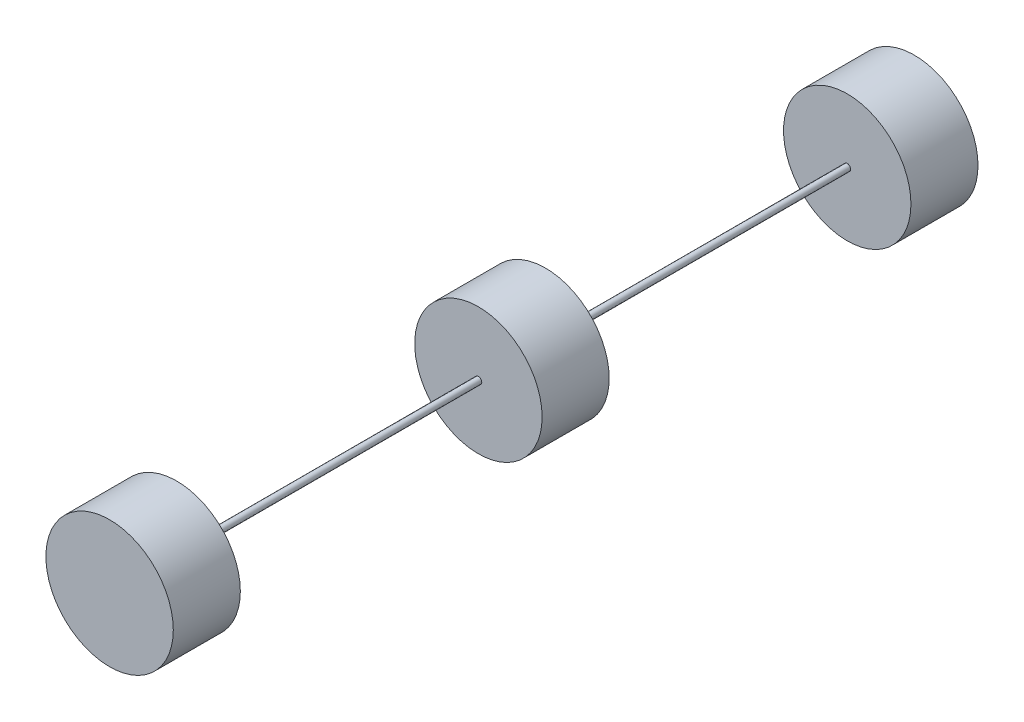
ISO-10303-21;
HEADER;
FILE_DESCRIPTION(('STEP AP214'),'2;1');
FILE_NAME('part.step','',(''),(''),'','','');
FILE_SCHEMA(('AUTOMOTIVE_DESIGN { 1 0 10303 214 1 1 1 1 }'));
ENDSEC;
DATA;
#1=APPLICATION_CONTEXT('core data for automotive mechanical design processes');
#2=APPLICATION_PROTOCOL_DEFINITION('international standard','automotive_design',2000,#1);
#3=PRODUCT_CONTEXT('',#1,'mechanical');
#4=PRODUCT('Part','Part','',(#3));
#5=PRODUCT_RELATED_PRODUCT_CATEGORY('part','',(#4));
#6=PRODUCT_DEFINITION_FORMATION('','',#4);
#7=PRODUCT_DEFINITION_CONTEXT('part definition',#1,'design');
#8=PRODUCT_DEFINITION('design','',#6,#7);
#9=PRODUCT_DEFINITION_SHAPE('','',#8);
#10=(LENGTH_UNIT() NAMED_UNIT(*) SI_UNIT(.MILLI.,.METRE.));
#11=(NAMED_UNIT(*) PLANE_ANGLE_UNIT() SI_UNIT($,.RADIAN.));
#12=(NAMED_UNIT(*) SI_UNIT($,.STERADIAN.) SOLID_ANGLE_UNIT());
#13=UNCERTAINTY_MEASURE_WITH_UNIT(LENGTH_MEASURE(1.E-05),#10,'distance_accuracy_value','');
#14=(GEOMETRIC_REPRESENTATION_CONTEXT(3) GLOBAL_UNCERTAINTY_ASSIGNED_CONTEXT((#13)) GLOBAL_UNIT_ASSIGNED_CONTEXT((#10,
#11,#12)) REPRESENTATION_CONTEXT('',''));
#15=CARTESIAN_POINT('',(0.,0.,0.));
#16=DIRECTION('',(0.,0.,1.));
#17=DIRECTION('',(1.,0.,0.));
#18=AXIS2_PLACEMENT_3D('',#15,#16,#17);
#19=CARTESIAN_POINT('',(0.,0.,20.));
#20=DIRECTION('',(0.,0.,-1.));
#21=DIRECTION('',(-1.,0.,0.));
#22=AXIS2_PLACEMENT_3D('',#19,#20,#21);
#23=CYLINDRICAL_SURFACE('',#22,19.);
#24=CARTESIAN_POINT('',(0.,0.,20.));
#25=DIRECTION('',(0.,0.,1.));
#26=DIRECTION('',(1.,0.,0.));
#27=AXIS2_PLACEMENT_3D('',#24,#25,#26);
#28=CIRCLE('',#27,19.);
#29=CARTESIAN_POINT('',(19.,0.,20.));
#30=VERTEX_POINT('',#29);
#31=EDGE_CURVE('E10',#30,#30,#28,.T.);
#32=ORIENTED_EDGE('',*,*,#31,.F.);
#33=EDGE_LOOP('',(#32));
#34=FACE_BOUND('',#33,.T.);
#35=CARTESIAN_POINT('',(0.,0.,0.));
#36=DIRECTION('',(0.,0.,1.));
#37=DIRECTION('',(1.,0.,0.));
#38=AXIS2_PLACEMENT_3D('',#35,#36,#37);
#39=CIRCLE('',#38,19.);
#40=CARTESIAN_POINT('',(19.,0.,0.));
#41=VERTEX_POINT('',#40);
#42=EDGE_CURVE('E42',#41,#41,#39,.T.);
#43=ORIENTED_EDGE('',*,*,#42,.T.);
#44=EDGE_LOOP('',(#43));
#45=FACE_BOUND('',#44,.T.);
#46=ADVANCED_FACE('F39',(#34,#45),#23,.T.);
#47=CARTESIAN_POINT('',(0.,0.,20.));
#48=DIRECTION('',(0.,0.,1.));
#49=DIRECTION('',(1.,0.,0.));
#50=AXIS2_PLACEMENT_3D('',#47,#48,#49);
#51=PLANE('',#50);
#52=CARTESIAN_POINT('',(0.,0.,20.));
#53=DIRECTION('',(0.,0.,1.));
#54=DIRECTION('',(1.,0.,0.));
#55=AXIS2_PLACEMENT_3D('',#52,#53,#54);
#56=CIRCLE('',#55,1.);
#57=CARTESIAN_POINT('',(-1.,0.,20.));
#58=VERTEX_POINT('',#57);
#59=EDGE_CURVE('E53',#58,#58,#56,.T.);
#60=ORIENTED_EDGE('',*,*,#59,.F.);
#61=EDGE_LOOP('',(#60));
#62=FACE_BOUND('',#61,.T.);
#63=ORIENTED_EDGE('',*,*,#31,.T.);
#64=EDGE_LOOP('',(#63));
#65=FACE_BOUND('',#64,.T.);
#66=ADVANCED_FACE('F103',(#62,#65),#51,.T.);
#67=CARTESIAN_POINT('',(0.,0.,0.));
#68=DIRECTION('',(0.,0.,1.));
#69=DIRECTION('',(1.,0.,0.));
#70=AXIS2_PLACEMENT_3D('',#67,#68,#69);
#71=PLANE('',#70);
#72=ORIENTED_EDGE('',*,*,#42,.F.);
#73=EDGE_LOOP('',(#72));
#74=FACE_BOUND('',#73,.T.);
#75=ADVANCED_FACE('F108',(#74),#71,.F.);
#76=CARTESIAN_POINT('',(0.,0.,110.));
#77=DIRECTION('',(0.,0.,-1.));
#78=DIRECTION('',(-1.,0.,0.));
#79=AXIS2_PLACEMENT_3D('',#76,#77,#78);
#80=CYLINDRICAL_SURFACE('',#79,1.);
#81=CARTESIAN_POINT('',(0.,0.,110.));
#82=DIRECTION('',(0.,0.,1.));
#83=DIRECTION('',(1.,0.,0.));
#84=AXIS2_PLACEMENT_3D('',#81,#82,#83);
#85=CIRCLE('',#84,1.);
#86=CARTESIAN_POINT('',(-1.,0.,110.));
#87=VERTEX_POINT('',#86);
#88=EDGE_CURVE('E51',#87,#87,#85,.T.);
#89=CARTESIAN_POINT('',(-1.,0.,110.));
#90=CARTESIAN_POINT('',(-1.,0.,109.0625));
#91=CARTESIAN_POINT('',(-1.,0.,108.125));
#92=CARTESIAN_POINT('',(-1.,0.,106.25));
#93=CARTESIAN_POINT('',(-1.,0.,105.3125));
#94=CARTESIAN_POINT('',(-1.,0.,103.4375));
#95=CARTESIAN_POINT('',(-1.,0.,102.5));
#96=CARTESIAN_POINT('',(-1.,0.,100.625));
#97=CARTESIAN_POINT('',(-1.,0.,99.6875));
#98=CARTESIAN_POINT('',(-1.,0.,97.8125));
#99=CARTESIAN_POINT('',(-1.,0.,96.875));
#100=CARTESIAN_POINT('',(-1.,0.,95.));
#101=CARTESIAN_POINT('',(-1.,0.,94.0625));
#102=CARTESIAN_POINT('',(-1.,0.,92.1875));
#103=CARTESIAN_POINT('',(-1.,0.,91.25));
#104=CARTESIAN_POINT('',(-1.,0.,89.375));
#105=CARTESIAN_POINT('',(-1.,0.,88.4375));
#106=CARTESIAN_POINT('',(-1.,0.,86.5625));
#107=CARTESIAN_POINT('',(-1.,0.,85.625));
#108=CARTESIAN_POINT('',(-1.,0.,83.75));
#109=CARTESIAN_POINT('',(-1.,0.,82.8125));
#110=CARTESIAN_POINT('',(-1.,0.,80.9375));
#111=CARTESIAN_POINT('',(-1.,0.,80.));
#112=CARTESIAN_POINT('',(-1.,0.,78.125));
#113=CARTESIAN_POINT('',(-1.,0.,77.1875));
#114=CARTESIAN_POINT('',(-1.,0.,75.3125));
#115=CARTESIAN_POINT('',(-1.,0.,74.375));
#116=CARTESIAN_POINT('',(-1.,0.,72.5));
#117=CARTESIAN_POINT('',(-1.,0.,71.5625));
#118=CARTESIAN_POINT('',(-1.,0.,69.6875));
#119=CARTESIAN_POINT('',(-1.,0.,68.75));
#120=CARTESIAN_POINT('',(-1.,0.,66.875));
#121=CARTESIAN_POINT('',(-1.,0.,65.9375));
#122=CARTESIAN_POINT('',(-1.,0.,64.0625));
#123=CARTESIAN_POINT('',(-1.,0.,63.125));
#124=CARTESIAN_POINT('',(-1.,0.,61.25));
#125=CARTESIAN_POINT('',(-1.,0.,60.3125));
#126=CARTESIAN_POINT('',(-1.,0.,58.4375));
#127=CARTESIAN_POINT('',(-1.,0.,57.5));
#128=CARTESIAN_POINT('',(-1.,0.,55.625));
#129=CARTESIAN_POINT('',(-1.,0.,54.6875));
#130=CARTESIAN_POINT('',(-1.,0.,52.8125));
#131=CARTESIAN_POINT('',(-1.,0.,51.875));
#132=CARTESIAN_POINT('',(-1.,0.,50.));
#133=CARTESIAN_POINT('',(-1.,0.,49.0625));
#134=CARTESIAN_POINT('',(-1.,0.,47.1875));
#135=CARTESIAN_POINT('',(-1.,0.,46.25));
#136=CARTESIAN_POINT('',(-1.,0.,44.375));
#137=CARTESIAN_POINT('',(-1.,0.,43.4375));
#138=CARTESIAN_POINT('',(-1.,0.,41.5625));
#139=CARTESIAN_POINT('',(-1.,0.,40.625));
#140=CARTESIAN_POINT('',(-1.,0.,38.75));
#141=CARTESIAN_POINT('',(-1.,0.,37.8125));
#142=CARTESIAN_POINT('',(-1.,0.,35.9375));
#143=CARTESIAN_POINT('',(-1.,0.,35.));
#144=CARTESIAN_POINT('',(-1.,0.,33.125));
#145=CARTESIAN_POINT('',(-1.,0.,32.1875));
#146=CARTESIAN_POINT('',(-1.,0.,30.3125));
#147=CARTESIAN_POINT('',(-1.,0.,29.375));
#148=CARTESIAN_POINT('',(-1.,0.,27.5));
#149=CARTESIAN_POINT('',(-1.,0.,26.5625));
#150=CARTESIAN_POINT('',(-1.,0.,24.6875));
#151=CARTESIAN_POINT('',(-1.,0.,23.75));
#152=CARTESIAN_POINT('',(-1.,0.,21.875));
#153=CARTESIAN_POINT('',(-1.,0.,20.9375));
#154=CARTESIAN_POINT('',(-1.,0.,20.));
#155=B_SPLINE_CURVE_WITH_KNOTS('',3,(#89,#90,#91,#92,#93,#94,#95,#96,#97,#98,#99,#100,#101,#102,
#103,#104,#105,#106,#107,#108,#109,#110,#111,#112,#113,#114,#115,#116,#117,#118,#119,#120,#121,
#122,#123,#124,#125,#126,#127,#128,#129,#130,#131,#132,#133,#134,#135,#136,#137,#138,#139,#140,
#141,#142,#143,#144,#145,#146,#147,#148,#149,#150,#151,#152,#153,#154),.UNSPECIFIED.,.F.,.F.,(4,
2,2,2,2,2,2,2,2,2,2,2,2,2,2,2,2,2,2,2,2,2,2,2,2,2,2,2,2,2,2,2,4),(0.,2.81250000000001,
5.62500000000001,8.4375,11.25,14.0625,16.875,19.6875,22.5,25.3125,28.125,30.9375,33.75,36.5625,
39.375,42.1875,45.,47.8125,50.625,53.4375,56.25,59.0625,61.875,64.6875,67.5,70.3125,73.125,
75.9375,78.75,81.5625,84.375,87.1875,90.),.UNSPECIFIED.);
#156=EDGE_CURVE('BSEAM115',#87,#58,#155,.T.);
#157=ORIENTED_EDGE('',*,*,#88,.F.);
#158=ORIENTED_EDGE('',*,*,#59,.T.);
#159=ORIENTED_EDGE('',*,*,#156,.T.);
#160=ORIENTED_EDGE('',*,*,#156,.F.);
#161=EDGE_LOOP('',(#157,#159,#158,#160));
#162=FACE_BOUND('',#161,.T.);
#163=ADVANCED_FACE('F115',(#162),#80,.T.);
#164=CARTESIAN_POINT('',(0.,0.,130.));
#165=DIRECTION('',(0.,0.,-1.));
#166=DIRECTION('',(-1.,0.,0.));
#167=AXIS2_PLACEMENT_3D('',#164,#165,#166);
#168=CYLINDRICAL_SURFACE('',#167,19.);
#169=CARTESIAN_POINT('',(0.,0.,130.));
#170=DIRECTION('',(0.,0.,1.));
#171=DIRECTION('',(1.,0.,0.));
#172=AXIS2_PLACEMENT_3D('',#169,#170,#171);
#173=CIRCLE('',#172,19.);
#174=CARTESIAN_POINT('',(19.,0.,130.));
#175=VERTEX_POINT('',#174);
#176=EDGE_CURVE('E57',#175,#175,#173,.T.);
#177=ORIENTED_EDGE('',*,*,#176,.F.);
#178=EDGE_LOOP('',(#177));
#179=FACE_BOUND('',#178,.T.);
#180=CARTESIAN_POINT('',(0.,0.,110.));
#181=DIRECTION('',(0.,0.,1.));
#182=DIRECTION('',(1.,0.,0.));
#183=AXIS2_PLACEMENT_3D('',#180,#181,#182);
#184=CIRCLE('',#183,19.);
#185=CARTESIAN_POINT('',(19.,0.,110.));
#186=VERTEX_POINT('',#185);
#187=EDGE_CURVE('E61',#186,#186,#184,.T.);
#188=ORIENTED_EDGE('',*,*,#187,.T.);
#189=EDGE_LOOP('',(#188));
#190=FACE_BOUND('',#189,.T.);
#191=ADVANCED_FACE('F119',(#179,#190),#168,.T.);
#192=CARTESIAN_POINT('',(0.,0.,130.));
#193=DIRECTION('',(0.,0.,1.));
#194=DIRECTION('',(1.,0.,0.));
#195=AXIS2_PLACEMENT_3D('',#192,#193,#194);
#196=PLANE('',#195);
#197=CARTESIAN_POINT('',(0.,0.,130.));
#198=DIRECTION('',(0.,0.,1.));
#199=DIRECTION('',(1.,0.,0.));
#200=AXIS2_PLACEMENT_3D('',#197,#198,#199);
#201=CIRCLE('',#200,1.);
#202=CARTESIAN_POINT('',(-1.,0.,130.));
#203=VERTEX_POINT('',#202);
#204=EDGE_CURVE('E69',#203,#203,#201,.T.);
#205=ORIENTED_EDGE('',*,*,#204,.F.);
#206=EDGE_LOOP('',(#205));
#207=FACE_BOUND('',#206,.T.);
#208=ORIENTED_EDGE('',*,*,#176,.T.);
#209=EDGE_LOOP('',(#208));
#210=FACE_BOUND('',#209,.T.);
#211=ADVANCED_FACE('F125',(#207,#210),#196,.T.);
#212=CARTESIAN_POINT('',(0.,0.,110.));
#213=DIRECTION('',(0.,0.,1.));
#214=DIRECTION('',(1.,0.,0.));
#215=AXIS2_PLACEMENT_3D('',#212,#213,#214);
#216=PLANE('',#215);
#217=ORIENTED_EDGE('',*,*,#88,.T.);
#218=EDGE_LOOP('',(#217));
#219=FACE_BOUND('',#218,.T.);
#220=ORIENTED_EDGE('',*,*,#187,.F.);
#221=EDGE_LOOP('',(#220));
#222=FACE_BOUND('',#221,.T.);
#223=ADVANCED_FACE('F127',(#219,#222),#216,.F.);
#224=CARTESIAN_POINT('',(0.,0.,220.));
#225=DIRECTION('',(0.,0.,-1.));
#226=DIRECTION('',(-1.,0.,0.));
#227=AXIS2_PLACEMENT_3D('',#224,#225,#226);
#228=CYLINDRICAL_SURFACE('',#227,1.);
#229=CARTESIAN_POINT('',(0.,0.,220.));
#230=DIRECTION('',(0.,0.,1.));
#231=DIRECTION('',(1.,0.,0.));
#232=AXIS2_PLACEMENT_3D('',#229,#230,#231);
#233=CIRCLE('',#232,1.);
#234=CARTESIAN_POINT('',(-1.,0.,220.));
#235=VERTEX_POINT('',#234);
#236=EDGE_CURVE('E65',#235,#235,#233,.T.);
#237=CARTESIAN_POINT('',(-1.,0.,220.));
#238=CARTESIAN_POINT('',(-1.,0.,219.0625));
#239=CARTESIAN_POINT('',(-1.,0.,218.125));
#240=CARTESIAN_POINT('',(-1.,0.,216.25));
#241=CARTESIAN_POINT('',(-1.,0.,215.3125));
#242=CARTESIAN_POINT('',(-1.,0.,213.4375));
#243=CARTESIAN_POINT('',(-1.,0.,212.5));
#244=CARTESIAN_POINT('',(-1.,0.,210.625));
#245=CARTESIAN_POINT('',(-1.,0.,209.6875));
#246=CARTESIAN_POINT('',(-1.,0.,207.8125));
#247=CARTESIAN_POINT('',(-1.,0.,206.875));
#248=CARTESIAN_POINT('',(-1.,0.,205.));
#249=CARTESIAN_POINT('',(-1.,0.,204.0625));
#250=CARTESIAN_POINT('',(-1.,0.,202.1875));
#251=CARTESIAN_POINT('',(-1.,0.,201.25));
#252=CARTESIAN_POINT('',(-1.,0.,199.375));
#253=CARTESIAN_POINT('',(-1.,0.,198.4375));
#254=CARTESIAN_POINT('',(-1.,0.,196.5625));
#255=CARTESIAN_POINT('',(-1.,0.,195.625));
#256=CARTESIAN_POINT('',(-1.,0.,193.75));
#257=CARTESIAN_POINT('',(-1.,0.,192.8125));
#258=CARTESIAN_POINT('',(-1.,0.,190.9375));
#259=CARTESIAN_POINT('',(-1.,0.,190.));
#260=CARTESIAN_POINT('',(-1.,0.,188.125));
#261=CARTESIAN_POINT('',(-1.,0.,187.1875));
#262=CARTESIAN_POINT('',(-1.,0.,185.3125));
#263=CARTESIAN_POINT('',(-1.,0.,184.375));
#264=CARTESIAN_POINT('',(-1.,0.,182.5));
#265=CARTESIAN_POINT('',(-1.,0.,181.5625));
#266=CARTESIAN_POINT('',(-1.,0.,179.6875));
#267=CARTESIAN_POINT('',(-1.,0.,178.75));
#268=CARTESIAN_POINT('',(-1.,0.,176.875));
#269=CARTESIAN_POINT('',(-1.,0.,175.9375));
#270=CARTESIAN_POINT('',(-1.,0.,174.0625));
#271=CARTESIAN_POINT('',(-1.,0.,173.125));
#272=CARTESIAN_POINT('',(-1.,0.,171.25));
#273=CARTESIAN_POINT('',(-1.,0.,170.3125));
#274=CARTESIAN_POINT('',(-1.,0.,168.4375));
#275=CARTESIAN_POINT('',(-1.,0.,167.5));
#276=CARTESIAN_POINT('',(-1.,0.,165.625));
#277=CARTESIAN_POINT('',(-1.,0.,164.6875));
#278=CARTESIAN_POINT('',(-1.,0.,162.8125));
#279=CARTESIAN_POINT('',(-1.,0.,161.875));
#280=CARTESIAN_POINT('',(-1.,0.,160.));
#281=CARTESIAN_POINT('',(-1.,0.,159.0625));
#282=CARTESIAN_POINT('',(-1.,0.,157.1875));
#283=CARTESIAN_POINT('',(-1.,0.,156.25));
#284=CARTESIAN_POINT('',(-1.,0.,154.375));
#285=CARTESIAN_POINT('',(-1.,0.,153.4375));
#286=CARTESIAN_POINT('',(-1.,0.,151.5625));
#287=CARTESIAN_POINT('',(-1.,0.,150.625));
#288=CARTESIAN_POINT('',(-1.,0.,148.75));
#289=CARTESIAN_POINT('',(-1.,0.,147.8125));
#290=CARTESIAN_POINT('',(-1.,0.,145.9375));
#291=CARTESIAN_POINT('',(-1.,0.,145.));
#292=CARTESIAN_POINT('',(-1.,0.,143.125));
#293=CARTESIAN_POINT('',(-1.,0.,142.1875));
#294=CARTESIAN_POINT('',(-1.,0.,140.3125));
#295=CARTESIAN_POINT('',(-1.,0.,139.375));
#296=CARTESIAN_POINT('',(-1.,0.,137.5));
#297=CARTESIAN_POINT('',(-1.,0.,136.5625));
#298=CARTESIAN_POINT('',(-1.,0.,134.6875));
#299=CARTESIAN_POINT('',(-1.,0.,133.75));
#300=CARTESIAN_POINT('',(-1.,0.,131.875));
#301=CARTESIAN_POINT('',(-1.,0.,130.9375));
#302=CARTESIAN_POINT('',(-1.,0.,130.));
#303=B_SPLINE_CURVE_WITH_KNOTS('',3,(#237,#238,#239,#240,#241,#242,#243,#244,#245,#246,#247,
#248,#249,#250,#251,#252,#253,#254,#255,#256,#257,#258,#259,#260,#261,#262,#263,#264,#265,#266,
#267,#268,#269,#270,#271,#272,#273,#274,#275,#276,#277,#278,#279,#280,#281,#282,#283,#284,#285,
#286,#287,#288,#289,#290,#291,#292,#293,#294,#295,#296,#297,#298,#299,#300,#301,#302),
.UNSPECIFIED.,.F.,.F.,(4,2,2,2,2,2,2,2,2,2,2,2,2,2,2,2,2,2,2,2,2,2,2,2,2,2,2,2,2,2,2,2,4),(0.,
2.8125,5.62499999999999,8.43749999999999,11.25,14.0625,16.875,19.6875,22.5,25.3125,28.125,
30.9375,33.75,36.5625,39.375,42.1875,45.,47.8125,50.625,53.4375,56.25,59.0625,61.875,64.6875,
67.5,70.3125,73.125,75.9375,78.75,81.5625,84.375,87.1875,90.),.UNSPECIFIED.);
#304=EDGE_CURVE('BSEAM90',#235,#203,#303,.T.);
#305=ORIENTED_EDGE('',*,*,#236,.F.);
#306=ORIENTED_EDGE('',*,*,#204,.T.);
#307=ORIENTED_EDGE('',*,*,#304,.T.);
#308=ORIENTED_EDGE('',*,*,#304,.F.);
#309=EDGE_LOOP('',(#305,#307,#306,#308));
#310=FACE_BOUND('',#309,.T.);
#311=ADVANCED_FACE('F90',(#310),#228,.T.);
#312=CARTESIAN_POINT('',(0.,0.,240.));
#313=DIRECTION('',(0.,0.,-1.));
#314=DIRECTION('',(-1.,0.,0.));
#315=AXIS2_PLACEMENT_3D('',#312,#313,#314);
#316=CYLINDRICAL_SURFACE('',#315,19.);
#317=CARTESIAN_POINT('',(0.,0.,240.));
#318=DIRECTION('',(0.,0.,1.));
#319=DIRECTION('',(1.,0.,0.));
#320=AXIS2_PLACEMENT_3D('',#317,#318,#319);
#321=CIRCLE('',#320,19.);
#322=CARTESIAN_POINT('',(19.,0.,240.));
#323=VERTEX_POINT('',#322);
#324=EDGE_CURVE('E73',#323,#323,#321,.T.);
#325=ORIENTED_EDGE('',*,*,#324,.F.);
#326=EDGE_LOOP('',(#325));
#327=FACE_BOUND('',#326,.T.);
#328=CARTESIAN_POINT('',(0.,0.,220.));
#329=DIRECTION('',(0.,0.,1.));
#330=DIRECTION('',(1.,0.,0.));
#331=AXIS2_PLACEMENT_3D('',#328,#329,#330);
#332=CIRCLE('',#331,19.);
#333=CARTESIAN_POINT('',(19.,0.,220.));
#334=VERTEX_POINT('',#333);
#335=EDGE_CURVE('E77',#334,#334,#332,.T.);
#336=ORIENTED_EDGE('',*,*,#335,.T.);
#337=EDGE_LOOP('',(#336));
#338=FACE_BOUND('',#337,.T.);
#339=ADVANCED_FACE('F87',(#327,#338),#316,.T.);
#340=CARTESIAN_POINT('',(0.,0.,240.));
#341=DIRECTION('',(0.,0.,1.));
#342=DIRECTION('',(1.,0.,0.));
#343=AXIS2_PLACEMENT_3D('',#340,#341,#342);
#344=PLANE('',#343);
#345=ORIENTED_EDGE('',*,*,#324,.T.);
#346=EDGE_LOOP('',(#345));
#347=FACE_BOUND('',#346,.T.);
#348=ADVANCED_FACE('F85',(#347),#344,.T.);
#349=CARTESIAN_POINT('',(0.,0.,220.));
#350=DIRECTION('',(0.,0.,1.));
#351=DIRECTION('',(1.,0.,0.));
#352=AXIS2_PLACEMENT_3D('',#349,#350,#351);
#353=PLANE('',#352);
#354=ORIENTED_EDGE('',*,*,#236,.T.);
#355=EDGE_LOOP('',(#354));
#356=FACE_BOUND('',#355,.T.);
#357=ORIENTED_EDGE('',*,*,#335,.F.);
#358=EDGE_LOOP('',(#357));
#359=FACE_BOUND('',#358,.T.);
#360=ADVANCED_FACE('F94',(#356,#359),#353,.F.);
#361=CLOSED_SHELL('',(#46,#66,#75,#163,#191,#211,#223,#311,#339,#348,#360));
#362=MANIFOLD_SOLID_BREP('B2',#361);
#363=ADVANCED_BREP_SHAPE_REPRESENTATION('',(#18,#362),#14);
#364=SHAPE_DEFINITION_REPRESENTATION(#9,#363);
ENDSEC;
END-ISO-10303-21;
